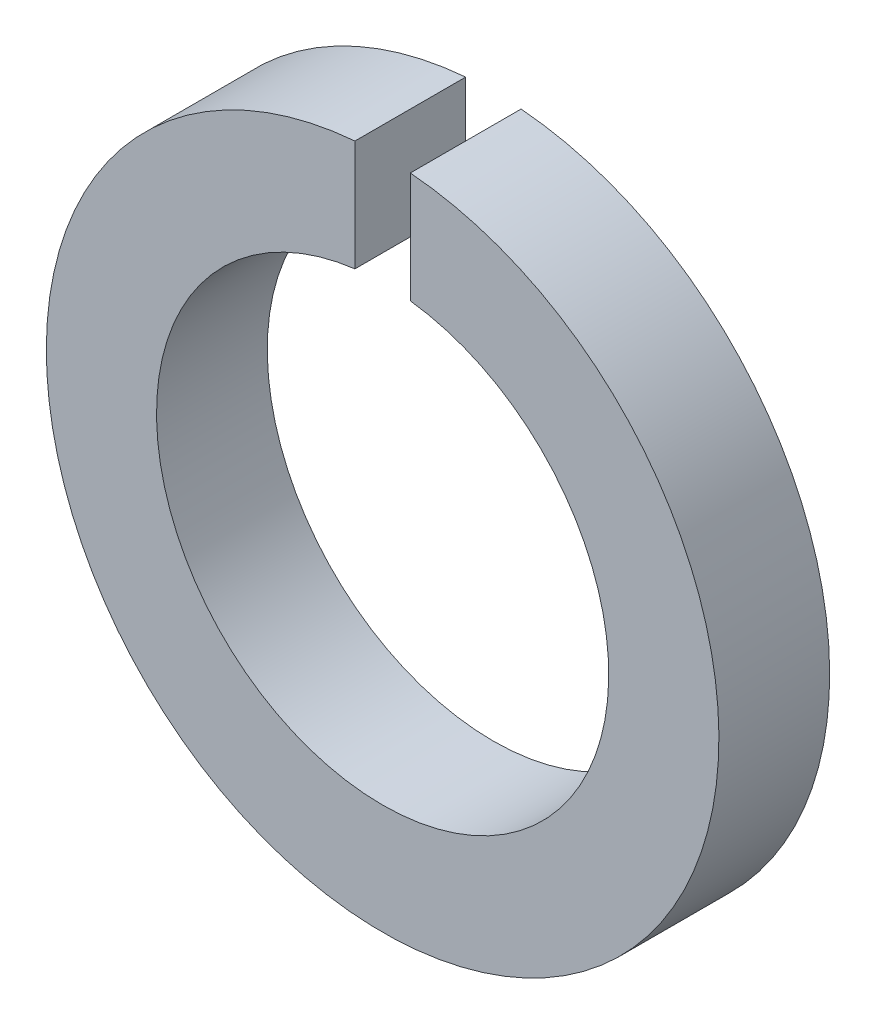
ISO-10303-21;
HEADER;
FILE_DESCRIPTION(('STEP AP214'),'2;1');
FILE_NAME('part.step','',(''),(''),'','','');
FILE_SCHEMA(('AUTOMOTIVE_DESIGN { 1 0 10303 214 1 1 1 1 }'));
ENDSEC;
DATA;
#1=APPLICATION_CONTEXT('core data for automotive mechanical design processes');
#2=APPLICATION_PROTOCOL_DEFINITION('international standard','automotive_design',2000,#1);
#3=PRODUCT_CONTEXT('',#1,'mechanical');
#4=PRODUCT('Part','Part','',(#3));
#5=PRODUCT_RELATED_PRODUCT_CATEGORY('part','',(#4));
#6=PRODUCT_DEFINITION_FORMATION('','',#4);
#7=PRODUCT_DEFINITION_CONTEXT('part definition',#1,'design');
#8=PRODUCT_DEFINITION('design','',#6,#7);
#9=PRODUCT_DEFINITION_SHAPE('','',#8);
#10=(LENGTH_UNIT() NAMED_UNIT(*) SI_UNIT(.MILLI.,.METRE.));
#11=(NAMED_UNIT(*) PLANE_ANGLE_UNIT() SI_UNIT($,.RADIAN.));
#12=(NAMED_UNIT(*) SI_UNIT($,.STERADIAN.) SOLID_ANGLE_UNIT());
#13=UNCERTAINTY_MEASURE_WITH_UNIT(LENGTH_MEASURE(1.E-05),#10,'distance_accuracy_value','');
#14=(GEOMETRIC_REPRESENTATION_CONTEXT(3) GLOBAL_UNCERTAINTY_ASSIGNED_CONTEXT((#13)) GLOBAL_UNIT_ASSIGNED_CONTEXT((#10,
#11,#12)) REPRESENTATION_CONTEXT('',''));
#15=CARTESIAN_POINT('',(0.,0.,0.));
#16=DIRECTION('',(0.,0.,1.));
#17=DIRECTION('',(1.,0.,0.));
#18=AXIS2_PLACEMENT_3D('',#15,#16,#17);
#19=CARTESIAN_POINT('',(0.,0.,6.));
#20=DIRECTION('',(0.,0.,-1.));
#21=DIRECTION('',(-1.,0.,0.));
#22=AXIS2_PLACEMENT_3D('',#19,#20,#21);
#23=CYLINDRICAL_SURFACE('',#22,18.2196678616668);
#24=CARTESIAN_POINT('',(0.,0.,0.));
#25=DIRECTION('',(0.,0.,1.));
#26=DIRECTION('',(1.,0.,0.));
#27=AXIS2_PLACEMENT_3D('',#24,#25,#26);
#28=CIRCLE('',#27,18.2196678616668);
#29=CARTESIAN_POINT('',(-1.49999999999999,18.1578164157878,0.));
#30=VERTEX_POINT('',#29);
#31=CARTESIAN_POINT('',(1.50000000000001,18.1578164157878,0.));
#32=VERTEX_POINT('',#31);
#33=EDGE_CURVE('E103',#30,#32,#28,.T.);
#34=ORIENTED_EDGE('',*,*,#33,.T.);
#35=DIRECTION('',(0.,0.,-1.));
#36=VECTOR('',#35,1.);
#37=CARTESIAN_POINT('',(1.50000000000001,18.1578164157878,6.));
#38=LINE('',#37,#36);
#39=CARTESIAN_POINT('',(1.50000000000001,18.1578164157878,6.));
#40=VERTEX_POINT('',#39);
#41=EDGE_CURVE('E11',#40,#32,#38,.T.);
#42=ORIENTED_EDGE('',*,*,#41,.F.);
#43=CARTESIAN_POINT('',(0.,0.,6.));
#44=DIRECTION('',(0.,0.,1.));
#45=DIRECTION('',(1.,0.,0.));
#46=AXIS2_PLACEMENT_3D('',#43,#44,#45);
#47=CIRCLE('',#46,18.2196678616668);
#48=CARTESIAN_POINT('',(-1.49999999999999,18.1578164157878,6.));
#49=VERTEX_POINT('',#48);
#50=EDGE_CURVE('E87',#49,#40,#47,.T.);
#51=ORIENTED_EDGE('',*,*,#50,.F.);
#52=DIRECTION('',(0.,0.,-1.));
#53=VECTOR('',#52,1.);
#54=CARTESIAN_POINT('',(-1.49999999999999,18.1578164157878,6.));
#55=LINE('',#54,#53);
#56=EDGE_CURVE('E99',#49,#30,#55,.T.);
#57=ORIENTED_EDGE('',*,*,#56,.T.);
#58=EDGE_LOOP('',(#34,#42,#51,#57));
#59=FACE_BOUND('',#58,.T.);
#60=ADVANCED_FACE('F36',(#59),#23,.T.);
#61=CARTESIAN_POINT('',(1.50000000000001,18.1578164157878,6.));
#62=DIRECTION('',(1.,0.,0.));
#63=DIRECTION('',(0.,0.,-1.));
#64=AXIS2_PLACEMENT_3D('',#61,#62,#63);
#65=PLANE('',#64);
#66=DIRECTION('',(0.,-1.,0.));
#67=VECTOR('',#66,1.);
#68=CARTESIAN_POINT('',(1.50000000000001,18.1578164157878,0.));
#69=LINE('',#68,#67);
#70=CARTESIAN_POINT('',(1.5,12.1578164157878,0.));
#71=VERTEX_POINT('',#70);
#72=EDGE_CURVE('E91',#32,#71,#69,.T.);
#73=ORIENTED_EDGE('',*,*,#72,.T.);
#74=DIRECTION('',(0.,0.,-1.));
#75=VECTOR('',#74,1.);
#76=CARTESIAN_POINT('',(1.5,12.1578164157878,6.));
#77=LINE('',#76,#75);
#78=CARTESIAN_POINT('',(1.5,12.1578164157878,6.));
#79=VERTEX_POINT('',#78);
#80=EDGE_CURVE('E44',#79,#71,#77,.T.);
#81=ORIENTED_EDGE('',*,*,#80,.F.);
#82=DIRECTION('',(0.,-1.,0.));
#83=VECTOR('',#82,1.);
#84=CARTESIAN_POINT('',(1.50000000000001,18.1578164157878,6.));
#85=LINE('',#84,#83);
#86=EDGE_CURVE('E82',#40,#79,#85,.T.);
#87=ORIENTED_EDGE('',*,*,#86,.F.);
#88=ORIENTED_EDGE('',*,*,#41,.T.);
#89=EDGE_LOOP('',(#73,#81,#87,#88));
#90=FACE_BOUND('',#89,.T.);
#91=ADVANCED_FACE('F90',(#90),#65,.F.);
#92=CARTESIAN_POINT('',(0.,0.,6.));
#93=DIRECTION('',(0.,0.,-1.));
#94=DIRECTION('',(-1.,0.,0.));
#95=AXIS2_PLACEMENT_3D('',#92,#93,#94);
#96=CYLINDRICAL_SURFACE('',#95,12.25);
#97=CARTESIAN_POINT('',(0.,0.,0.));
#98=DIRECTION('',(0.,0.,-1.));
#99=DIRECTION('',(1.,0.,0.));
#100=AXIS2_PLACEMENT_3D('',#97,#98,#99);
#101=CIRCLE('',#100,12.25);
#102=CARTESIAN_POINT('',(-1.49999999999999,12.1578164157878,0.));
#103=VERTEX_POINT('',#102);
#104=EDGE_CURVE('E69',#71,#103,#101,.T.);
#105=ORIENTED_EDGE('',*,*,#104,.T.);
#106=DIRECTION('',(0.,0.,-1.));
#107=VECTOR('',#106,1.);
#108=CARTESIAN_POINT('',(-1.49999999999999,12.1578164157878,6.));
#109=LINE('',#108,#107);
#110=CARTESIAN_POINT('',(-1.49999999999999,12.1578164157878,6.));
#111=VERTEX_POINT('',#110);
#112=EDGE_CURVE('E92',#111,#103,#109,.T.);
#113=ORIENTED_EDGE('',*,*,#112,.F.);
#114=CARTESIAN_POINT('',(0.,0.,6.));
#115=DIRECTION('',(0.,0.,-1.));
#116=DIRECTION('',(1.,0.,0.));
#117=AXIS2_PLACEMENT_3D('',#114,#115,#116);
#118=CIRCLE('',#117,12.25);
#119=EDGE_CURVE('E85',#79,#111,#118,.T.);
#120=ORIENTED_EDGE('',*,*,#119,.F.);
#121=ORIENTED_EDGE('',*,*,#80,.T.);
#122=EDGE_LOOP('',(#105,#113,#120,#121));
#123=FACE_BOUND('',#122,.T.);
#124=ADVANCED_FACE('F93',(#123),#96,.F.);
#125=CARTESIAN_POINT('',(-1.49999999999999,18.1578164157878,6.));
#126=DIRECTION('',(-1.,0.,0.));
#127=DIRECTION('',(0.,0.,1.));
#128=AXIS2_PLACEMENT_3D('',#125,#126,#127);
#129=PLANE('',#128);
#130=DIRECTION('',(0.,1.,0.));
#131=VECTOR('',#130,1.);
#132=CARTESIAN_POINT('',(-1.49999999999999,18.1578164157878,0.));
#133=LINE('',#132,#131);
#134=EDGE_CURVE('E75',#103,#30,#133,.T.);
#135=ORIENTED_EDGE('',*,*,#134,.T.);
#136=ORIENTED_EDGE('',*,*,#56,.F.);
#137=DIRECTION('',(0.,1.,0.));
#138=VECTOR('',#137,1.);
#139=CARTESIAN_POINT('',(-1.49999999999999,18.1578164157878,6.));
#140=LINE('',#139,#138);
#141=EDGE_CURVE('E52',#111,#49,#140,.T.);
#142=ORIENTED_EDGE('',*,*,#141,.F.);
#143=ORIENTED_EDGE('',*,*,#112,.T.);
#144=EDGE_LOOP('',(#135,#136,#142,#143));
#145=FACE_BOUND('',#144,.T.);
#146=ADVANCED_FACE('F111',(#145),#129,.F.);
#147=CARTESIAN_POINT('',(0.,0.,6.));
#148=DIRECTION('',(0.,0.,1.));
#149=DIRECTION('',(1.,0.,0.));
#150=AXIS2_PLACEMENT_3D('',#147,#148,#149);
#151=PLANE('',#150);
#152=ORIENTED_EDGE('',*,*,#50,.T.);
#153=ORIENTED_EDGE('',*,*,#86,.T.);
#154=ORIENTED_EDGE('',*,*,#119,.T.);
#155=ORIENTED_EDGE('',*,*,#141,.T.);
#156=EDGE_LOOP('',(#152,#153,#154,#155));
#157=FACE_BOUND('',#156,.T.);
#158=ADVANCED_FACE('F83',(#157),#151,.T.);
#159=CARTESIAN_POINT('',(0.,0.,0.));
#160=DIRECTION('',(0.,0.,1.));
#161=DIRECTION('',(1.,0.,0.));
#162=AXIS2_PLACEMENT_3D('',#159,#160,#161);
#163=PLANE('',#162);
#164=ORIENTED_EDGE('',*,*,#33,.F.);
#165=ORIENTED_EDGE('',*,*,#134,.F.);
#166=ORIENTED_EDGE('',*,*,#104,.F.);
#167=ORIENTED_EDGE('',*,*,#72,.F.);
#168=EDGE_LOOP('',(#164,#165,#166,#167));
#169=FACE_BOUND('',#168,.T.);
#170=ADVANCED_FACE('F114',(#169),#163,.F.);
#171=CLOSED_SHELL('',(#60,#91,#124,#146,#158,#170));
#172=MANIFOLD_SOLID_BREP('B2',#171);
#173=ADVANCED_BREP_SHAPE_REPRESENTATION('',(#18,#172),#14);
#174=SHAPE_DEFINITION_REPRESENTATION(#9,#173);
ENDSEC;
END-ISO-10303-21;
